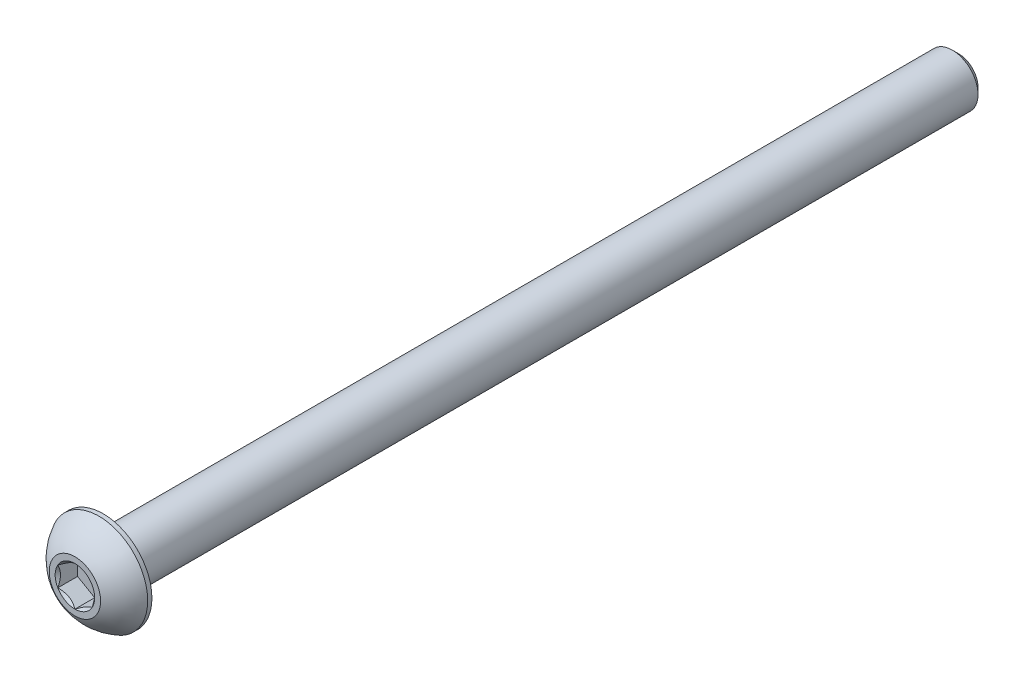
ISO-10303-21;
HEADER;
FILE_DESCRIPTION(('STEP AP214'),'2;1');
FILE_NAME('part.step','',(''),(''),'','','');
FILE_SCHEMA(('AUTOMOTIVE_DESIGN { 1 0 10303 214 1 1 1 1 }'));
ENDSEC;
DATA;
#1=APPLICATION_CONTEXT('core data for automotive mechanical design processes');
#2=APPLICATION_PROTOCOL_DEFINITION('international standard','automotive_design',2000,#1);
#3=PRODUCT_CONTEXT('',#1,'mechanical');
#4=PRODUCT('Part','Part','',(#3));
#5=PRODUCT_RELATED_PRODUCT_CATEGORY('part','',(#4));
#6=PRODUCT_DEFINITION_FORMATION('','',#4);
#7=PRODUCT_DEFINITION_CONTEXT('part definition',#1,'design');
#8=PRODUCT_DEFINITION('design','',#6,#7);
#9=PRODUCT_DEFINITION_SHAPE('','',#8);
#10=(LENGTH_UNIT() NAMED_UNIT(*) SI_UNIT(.MILLI.,.METRE.));
#11=(NAMED_UNIT(*) PLANE_ANGLE_UNIT() SI_UNIT($,.RADIAN.));
#12=(NAMED_UNIT(*) SI_UNIT($,.STERADIAN.) SOLID_ANGLE_UNIT());
#13=UNCERTAINTY_MEASURE_WITH_UNIT(LENGTH_MEASURE(1.E-05),#10,'distance_accuracy_value','');
#14=(GEOMETRIC_REPRESENTATION_CONTEXT(3) GLOBAL_UNCERTAINTY_ASSIGNED_CONTEXT((#13)) GLOBAL_UNIT_ASSIGNED_CONTEXT((#10,
#11,#12)) REPRESENTATION_CONTEXT('',''));
#15=CARTESIAN_POINT('',(0.,0.,0.));
#16=DIRECTION('',(0.,0.,1.));
#17=DIRECTION('',(1.,0.,0.));
#18=AXIS2_PLACEMENT_3D('',#15,#16,#17);
#19=CARTESIAN_POINT('',(0.,-1.49999999999999,-51.65));
#20=DIRECTION('',(0.,0.,-1.));
#21=DIRECTION('',(0.,1.,0.));
#22=AXIS2_PLACEMENT_3D('',#19,#20,#21);
#23=PLANE('',#22);
#24=CARTESIAN_POINT('',(0.,0.,-51.65));
#25=DIRECTION('',(0.,0.,-1.));
#26=DIRECTION('',(0.,1.,0.));
#27=AXIS2_PLACEMENT_3D('',#24,#25,#26);
#28=CIRCLE('',#27,1.12500000000001);
#29=CARTESIAN_POINT('',(0.,1.12500000000001,-51.65));
#30=VERTEX_POINT('',#29);
#31=EDGE_CURVE('E177',#30,#30,#28,.T.);
#32=ORIENTED_EDGE('',*,*,#31,.T.);
#33=EDGE_LOOP('',(#32));
#34=FACE_BOUND('',#33,.T.);
#35=ADVANCED_FACE('F37',(#34),#23,.T.);
#36=CARTESIAN_POINT('',(0.,0.,-51.65));
#37=DIRECTION('',(0.,0.,-1.));
#38=DIRECTION('',(0.,1.,0.));
#39=AXIS2_PLACEMENT_3D('',#36,#37,#38);
#40=CYLINDRICAL_SURFACE('',#39,1.5);
#41=CARTESIAN_POINT('',(0.,0.,-51.275));
#42=DIRECTION('',(0.,0.,-1.));
#43=DIRECTION('',(0.,1.,0.));
#44=AXIS2_PLACEMENT_3D('',#41,#42,#43);
#45=CIRCLE('',#44,1.5);
#46=CARTESIAN_POINT('',(0.,1.5,-51.275));
#47=VERTEX_POINT('',#46);
#48=EDGE_CURVE('E51',#47,#47,#45,.F.);
#49=ORIENTED_EDGE('',*,*,#48,.T.);
#50=EDGE_LOOP('',(#49));
#51=FACE_BOUND('',#50,.T.);
#52=CARTESIAN_POINT('',(0.,0.,-1.65));
#53=DIRECTION('',(0.,0.,1.));
#54=DIRECTION('',(1.,0.,0.));
#55=AXIS2_PLACEMENT_3D('',#52,#53,#54);
#56=CIRCLE('',#55,1.5);
#57=CARTESIAN_POINT('',(1.5,0.,-1.65));
#58=VERTEX_POINT('',#57);
#59=EDGE_CURVE('E174',#58,#58,#56,.F.);
#60=ORIENTED_EDGE('',*,*,#59,.T.);
#61=EDGE_LOOP('',(#60));
#62=FACE_BOUND('',#61,.T.);
#63=ADVANCED_FACE('F182',(#51,#62),#40,.T.);
#64=CARTESIAN_POINT('',(0.,0.,-51.65));
#65=DIRECTION('',(0.,0.,1.));
#66=DIRECTION('',(0.,-1.,0.));
#67=AXIS2_PLACEMENT_3D('',#64,#65,#66);
#68=CONICAL_SURFACE('',#67,1.12500000000001,0.785398163397444);
#69=ORIENTED_EDGE('',*,*,#48,.F.);
#70=EDGE_LOOP('',(#69));
#71=FACE_BOUND('',#70,.T.);
#72=ORIENTED_EDGE('',*,*,#31,.F.);
#73=EDGE_LOOP('',(#72));
#74=FACE_BOUND('',#73,.T.);
#75=ADVANCED_FACE('F39',(#71,#74),#68,.T.);
#76=CARTESIAN_POINT('',(0.,0.,-2.79483288770053));
#77=DIRECTION('',(0.,0.,1.));
#78=DIRECTION('',(0.,-1.,0.));
#79=AXIS2_PLACEMENT_3D('',#76,#77,#78);
#80=SPHERICAL_SURFACE('',#79,3.17192226735973);
#81=CARTESIAN_POINT('',(0.,0.,0.));
#82=DIRECTION('',(0.,0.,1.));
#83=DIRECTION('',(1.,0.,0.));
#84=AXIS2_PLACEMENT_3D('',#81,#82,#83);
#85=CIRCLE('',#84,1.5);
#86=CARTESIAN_POINT('',(0.,-1.5,0.));
#87=VERTEX_POINT('',#86);
#88=EDGE_CURVE('E171',#87,#87,#85,.T.);
#89=CARTESIAN_POINT('',(0.,0.,-1.4025));
#90=DIRECTION('',(0.,0.,1.));
#91=DIRECTION('',(1.,0.,0.));
#92=AXIS2_PLACEMENT_3D('',#89,#90,#91);
#93=CIRCLE('',#92,2.85);
#94=CARTESIAN_POINT('',(0.,-2.85,-1.4025));
#95=VERTEX_POINT('',#94);
#96=EDGE_CURVE('E165',#95,#95,#93,.T.);
#97=CARTESIAN_POINT('',(0.,-1.5,0.));
#98=CARTESIAN_POINT('',(0.,-1.5181600798921,-0.00974656947336525));
#99=CARTESIAN_POINT('',(0.,-1.53622513742981,-0.0196701847238475));
#100=CARTESIAN_POINT('',(0.,-1.57215840256594,-0.0398676311293121));
#101=CARTESIAN_POINT('',(0.,-1.59002661016438,-0.0501414622842944));
#102=CARTESIAN_POINT('',(0.,-1.6255593701915,-0.0710354648490241));
#103=CARTESIAN_POINT('',(0.,-1.64322392262019,-0.0816556362587714));
#104=CARTESIAN_POINT('',(0.,-1.67834266450262,-0.103238276426967));
#105=CARTESIAN_POINT('',(0.,-1.69579685395636,-0.114200745185416));
#106=CARTESIAN_POINT('',(0.,-1.73048823664554,-0.136463816635606));
#107=CARTESIAN_POINT('',(0.,-1.74772542988099,-0.147764419327347));
#108=CARTESIAN_POINT('',(0.,-1.78197627078176,-0.170699464187153));
#109=CARTESIAN_POINT('',(0.,-1.79898991844709,-0.182333906355219));
#110=CARTESIAN_POINT('',(0.,-1.83278720341135,-0.205932209546912));
#111=CARTESIAN_POINT('',(0.,-1.84957084071028,-0.21789607057054));
#112=CARTESIAN_POINT('',(0.,-1.88290172764636,-0.242148665498754));
#113=CARTESIAN_POINT('',(0.,-1.8994489772835,-0.254437399403341));
#114=CARTESIAN_POINT('',(0.,-1.93230080139369,-0.279335070725423));
#115=CARTESIAN_POINT('',(0.,-1.94860537586673,-0.291944008142919));
#116=CARTESIAN_POINT('',(0.,-1.98096565436365,-0.317477295441111));
#117=CARTESIAN_POINT('',(0.,-1.99702135838753,-0.330401645321806));
#118=CARTESIAN_POINT('',(0.,-2.02887779526296,-0.356560846652225));
#119=CARTESIAN_POINT('',(0.,-2.04467852811452,-0.369795698101948));
#120=CARTESIAN_POINT('',(0.,-2.07601901880464,-0.396570873693307));
#121=CARTESIAN_POINT('',(0.,-2.09155877664321,-0.410111197834943));
#122=CARTESIAN_POINT('',(0.,-2.12237141262985,-0.437492173862105));
#123=CARTESIAN_POINT('',(0.,-2.13764429077792,-0.451332825747633));
#124=CARTESIAN_POINT('',(0.,-2.16791736411296,-0.479309198198267));
#125=CARTESIAN_POINT('',(0.,-2.18291755929993,-0.493444918763374));
#126=CARTESIAN_POINT('',(0.,-2.21263956705415,-0.52200605739095));
#127=CARTESIAN_POINT('',(0.,-2.22736137962139,-0.536431475453418));
#128=CARTESIAN_POINT('',(0.,-2.2565210282552,-0.56556652781647));
#129=CARTESIAN_POINT('',(0.,-2.27095886432177,-0.580276162117054));
#130=CARTESIAN_POINT('',(0.,-2.2995450739765,-0.609974057702794));
#131=CARTESIAN_POINT('',(0.,-2.31369344756465,-0.624962318987951));
#132=CARTESIAN_POINT('',(0.,-2.34169535627252,-0.655211773418758));
#133=CARTESIAN_POINT('',(0.,-2.35554889139223,-0.670472966564409));
#134=CARTESIAN_POINT('',(0.,-2.38295585920366,-0.701262485885582));
#135=CARTESIAN_POINT('',(0.,-2.39650929189537,-0.716790812061104));
#136=CARTESIAN_POINT('',(0.,-2.42331090492182,-0.748108697108241));
#137=CARTESIAN_POINT('',(0.,-2.43655908525656,-0.763898255979857));
#138=CARTESIAN_POINT('',(0.,-2.46274515962755,-0.795732606824226));
#139=CARTESIAN_POINT('',(0.,-2.47568305366379,-0.811777398796979));
#140=CARTESIAN_POINT('',(0.,-2.50124363939651,-0.844116119267125));
#141=CARTESIAN_POINT('',(0.,-2.51386633109298,-0.860410047764518));
#142=CARTESIAN_POINT('',(0.,-2.53879171587278,-0.893240850042598));
#143=CARTESIAN_POINT('',(0.,-2.55109440895612,-0.909777723823285));
#144=CARTESIAN_POINT('',(0.,-2.57537512182785,-0.943088133113638));
#145=CARTESIAN_POINT('',(0.,-2.58735314161625,-0.959861668623304));
#146=CARTESIAN_POINT('',(0.,-2.61097995657956,-0.993639027894246));
#147=CARTESIAN_POINT('',(0.,-2.62262875175448,-1.01064285165552));
#148=CARTESIAN_POINT('',(0.,-2.64559269128199,-1.04487432644225));
#149=CARTESIAN_POINT('',(0.,-2.65690783563458,-1.06210197746771));
#150=CARTESIAN_POINT('',(0.,-2.67920017403639,-1.09677456077299));
#151=CARTESIAN_POINT('',(0.,-2.69017736808561,-1.11421949305282));
#152=CARTESIAN_POINT('',(0.,-2.711789634999,-1.14932001019995));
#153=CARTESIAN_POINT('',(0.,-2.72242470786316,-1.16697559506725));
#154=CARTESIAN_POINT('',(0.,-2.74334869082118,-1.20249070903943));
#155=CARTESIAN_POINT('',(0.,-2.75363760091502,-1.22035023814429));
#156=CARTESIAN_POINT('',(0.,-2.77386535089241,-1.25626645340824));
#157=CARTESIAN_POINT('',(0.,-2.78380419077596,-1.27432313956732));
#158=CARTESIAN_POINT('',(0.,-2.80332801615778,-1.31062681184411));
#159=CARTESIAN_POINT('',(0.,-2.81291300165605,-1.32887379796182));
#160=CARTESIAN_POINT('',(0.,-2.83172550494215,-1.3655511220839));
#161=CARTESIAN_POINT('',(0.,-2.84095302272998,-1.38398146008827));
#162=CARTESIAN_POINT('',(0.,-2.85,-1.4025));
#163=B_SPLINE_CURVE_WITH_KNOTS('',3,(#97,#98,#99,#100,#101,#102,#103,#104,#105,#106,#107,#108,
#109,#110,#111,#112,#113,#114,#115,#116,#117,#118,#119,#120,#121,#122,#123,#124,#125,#126,#127,
#128,#129,#130,#131,#132,#133,#134,#135,#136,#137,#138,#139,#140,#141,#142,#143,#144,#145,#146,
#147,#148,#149,#150,#151,#152,#153,#154,#155,#156,#157,#158,#159,#160,#161,#162),.UNSPECIFIED.,
.F.,.F.,(4,2,2,2,2,2,2,2,2,2,2,2,2,2,2,2,2,2,2,2,2,2,2,2,2,2,2,2,2,2,2,2,4),(0.,
0.0618298941826981,0.123659788365397,0.185489682548095,0.247319576730793,0.309149470913491,
0.37097936509619,0.432809259278888,0.494639153461585,0.556469047644284,0.618298941826982,
0.680128836009681,0.741958730192379,0.803788624375077,0.865618518557775,0.927448412740473,
0.989278306923172,1.05110820110587,1.11293809528857,1.17476798947127,1.23659788365396,
1.29842777783666,1.36025767201936,1.42208756620206,1.48391746038476,1.54574735456746,
1.60757724875015,1.66940714293285,1.73123703711555,1.79306693129825,1.85489682548095,
1.91672671966364,1.97855661384634),.UNSPECIFIED.);
#164=EDGE_CURVE('BSEAM187',#87,#95,#163,.T.);
#165=ORIENTED_EDGE('',*,*,#88,.F.);
#166=ORIENTED_EDGE('',*,*,#96,.T.);
#167=ORIENTED_EDGE('',*,*,#164,.T.);
#168=ORIENTED_EDGE('',*,*,#164,.F.);
#169=EDGE_LOOP('',(#165,#167,#166,#168));
#170=FACE_BOUND('',#169,.T.);
#171=ADVANCED_FACE('F187',(#170),#80,.T.);
#172=CARTESIAN_POINT('',(0.,-1.5,0.));
#173=DIRECTION('',(0.,0.,-1.));
#174=DIRECTION('',(-1.,0.,0.));
#175=AXIS2_PLACEMENT_3D('',#172,#173,#174);
#176=PLANE('',#175);
#177=CARTESIAN_POINT('',(0.,0.,0.));
#178=DIRECTION('',(0.,0.,1.));
#179=DIRECTION('',(1.,0.,0.));
#180=AXIS2_PLACEMENT_3D('',#177,#178,#179);
#181=CIRCLE('',#180,1.15470053837925);
#182=CARTESIAN_POINT('',(-1.,0.577350269189626,0.));
#183=VERTEX_POINT('',#182);
#184=CARTESIAN_POINT('',(-1.,-0.577350269189626,0.));
#185=VERTEX_POINT('',#184);
#186=EDGE_CURVE('E64',#183,#185,#181,.T.);
#187=ORIENTED_EDGE('',*,*,#186,.F.);
#188=CARTESIAN_POINT('',(0.,1.15470053837925,0.));
#189=VERTEX_POINT('',#188);
#190=EDGE_CURVE('E136',#189,#183,#181,.T.);
#191=ORIENTED_EDGE('',*,*,#190,.F.);
#192=CARTESIAN_POINT('',(1.,0.577350269189626,0.));
#193=VERTEX_POINT('',#192);
#194=EDGE_CURVE('E133',#193,#189,#181,.T.);
#195=ORIENTED_EDGE('',*,*,#194,.F.);
#196=CARTESIAN_POINT('',(1.,-0.577350269189626,0.));
#197=VERTEX_POINT('',#196);
#198=EDGE_CURVE('E104',#197,#193,#181,.T.);
#199=ORIENTED_EDGE('',*,*,#198,.F.);
#200=CARTESIAN_POINT('',(0.,-1.15470053837925,0.));
#201=VERTEX_POINT('',#200);
#202=EDGE_CURVE('E96',#201,#197,#181,.T.);
#203=ORIENTED_EDGE('',*,*,#202,.F.);
#204=EDGE_CURVE('E57',#185,#201,#181,.T.);
#205=ORIENTED_EDGE('',*,*,#204,.F.);
#206=EDGE_LOOP('',(#187,#191,#195,#199,#203,#205));
#207=FACE_BOUND('',#206,.T.);
#208=ORIENTED_EDGE('',*,*,#88,.T.);
#209=EDGE_LOOP('',(#208));
#210=FACE_BOUND('',#209,.T.);
#211=ADVANCED_FACE('F130',(#207,#210),#176,.F.);
#212=CARTESIAN_POINT('',(0.,-2.85,-1.65));
#213=DIRECTION('',(0.,0.,1.));
#214=DIRECTION('',(1.,0.,0.));
#215=AXIS2_PLACEMENT_3D('',#212,#213,#214);
#216=PLANE('',#215);
#217=ORIENTED_EDGE('',*,*,#59,.F.);
#218=EDGE_LOOP('',(#217));
#219=FACE_BOUND('',#218,.T.);
#220=CARTESIAN_POINT('',(0.,0.,-1.65));
#221=DIRECTION('',(0.,0.,1.));
#222=DIRECTION('',(1.,0.,0.));
#223=AXIS2_PLACEMENT_3D('',#220,#221,#222);
#224=CIRCLE('',#223,2.85);
#225=CARTESIAN_POINT('',(2.85,0.,-1.65));
#226=VERTEX_POINT('',#225);
#227=EDGE_CURVE('E168',#226,#226,#224,.T.);
#228=ORIENTED_EDGE('',*,*,#227,.F.);
#229=EDGE_LOOP('',(#228));
#230=FACE_BOUND('',#229,.T.);
#231=ADVANCED_FACE('F201',(#219,#230),#216,.F.);
#232=CARTESIAN_POINT('',(0.,0.,0.));
#233=DIRECTION('',(0.,0.,1.));
#234=DIRECTION('',(1.,0.,0.));
#235=AXIS2_PLACEMENT_3D('',#232,#233,#234);
#236=CYLINDRICAL_SURFACE('',#235,2.85);
#237=ORIENTED_EDGE('',*,*,#96,.F.);
#238=EDGE_LOOP('',(#237));
#239=FACE_BOUND('',#238,.T.);
#240=ORIENTED_EDGE('',*,*,#227,.T.);
#241=EDGE_LOOP('',(#240));
#242=FACE_BOUND('',#241,.T.);
#243=ADVANCED_FACE('F204',(#239,#242),#236,.T.);
#244=CARTESIAN_POINT('',(0.,0.,0.));
#245=DIRECTION('',(0.,0.,1.));
#246=DIRECTION('',(1.,0.,0.));
#247=AXIS2_PLACEMENT_3D('',#244,#245,#246);
#248=CONICAL_SURFACE('',#247,1.15470053837925,0.78539816339745);
#249=ORIENTED_EDGE('',*,*,#198,.T.);
#250=CARTESIAN_POINT('',(1.,-1.15147208646462,0.370385677513861));
#251=CARTESIAN_POINT('',(1.,-1.12343447988552,0.349219919873711));
#252=CARTESIAN_POINT('',(1.,-1.09524064850697,0.328261692175909));
#253=CARTESIAN_POINT('',(1.,-1.03847715644376,0.286846022235621));
#254=CARTESIAN_POINT('',(1.,-1.00990740382975,0.266388706123658));
#255=CARTESIAN_POINT('',(1.,-0.923120894333476,0.205604794954508));
#256=CARTESIAN_POINT('',(1.,-0.864253173759059,0.166192228961397));
#257=CARTESIAN_POINT('',(1.,-0.740809858258045,0.0888206642002044));
#258=CARTESIAN_POINT('',(1.,-0.676100255137807,0.0510730391143415));
#259=CARTESIAN_POINT('',(1.,-0.543448939049124,-0.0179754124487089));
#260=CARTESIAN_POINT('',(1.,-0.475519112027778,-0.0492979721531352));
#261=CARTESIAN_POINT('',(1.,-0.373555850333528,-0.0876182211162057));
#262=CARTESIAN_POINT('',(1.,-0.341031989670907,-0.0986164083578442));
#263=CARTESIAN_POINT('',(1.,-0.275199079052293,-0.11800165785264));
#264=CARTESIAN_POINT('',(1.,-0.241889975173933,-0.126388540223301));
#265=CARTESIAN_POINT('',(1.,-0.175247517042992,-0.139974779280984));
#266=CARTESIAN_POINT('',(1.,-0.141925568218175,-0.145229209232033));
#267=CARTESIAN_POINT('',(1.,-0.0749144362322788,-0.152451313429108));
#268=CARTESIAN_POINT('',(1.,-0.0412251978501616,-0.154418486389493));
#269=CARTESIAN_POINT('',(1.,0.0249580992634212,-0.15491680160684));
#270=CARTESIAN_POINT('',(1.,0.0574512826460396,-0.153569732111366));
#271=CARTESIAN_POINT('',(1.,0.122148505701867,-0.147783515501016));
#272=CARTESIAN_POINT('',(1.,0.154352610132927,-0.143345079338465));
#273=CARTESIAN_POINT('',(1.,0.21879989886764,-0.131543169854797));
#274=CARTESIAN_POINT('',(1.,0.251033743268954,-0.124129458961491));
#275=CARTESIAN_POINT('',(1.,0.314797132354919,-0.106771057501325));
#276=CARTESIAN_POINT('',(1.,0.346326735731005,-0.0968265787111708));
#277=CARTESIAN_POINT('',(1.,0.445594187730205,-0.0617765174456637));
#278=CARTESIAN_POINT('',(1.,0.511919139476036,-0.0326791416432759));
#279=CARTESIAN_POINT('',(1.,0.641453244657532,0.0320153296865042));
#280=CARTESIAN_POINT('',(1.,0.704650133126344,0.0676357767152411));
#281=CARTESIAN_POINT('',(1.,0.825428490174987,0.141123901346935));
#282=CARTESIAN_POINT('',(1.,0.883132947867685,0.178791947135463));
#283=CARTESIAN_POINT('',(1.,0.968148853704565,0.237022852943162));
#284=CARTESIAN_POINT('',(1.,0.996120570380285,0.256638475762856));
#285=CARTESIAN_POINT('',(1.,1.05168177729901,0.29638851706127));
#286=CARTESIAN_POINT('',(1.,1.079271369977,0.316522792198831));
#287=CARTESIAN_POINT('',(1.,1.10670185346329,0.336872119072971));
#288=B_SPLINE_CURVE_WITH_KNOTS('',3,(#250,#251,#252,#253,#254,#255,#256,#257,#258,#259,#260,
#261,#262,#263,#264,#265,#266,#267,#268,#269,#270,#271,#272,#273,#274,#275,#276,#277,#278,#279,
#280,#281,#282,#283,#284,#285,#286,#287),.UNSPECIFIED.,.F.,.F.,(4,2,2,2,2,2,2,2,2,2,2,2,2,2,2,2,
2,2,4),(0.,0.105386459083291,0.210799187330124,0.423233611565469,0.647793540908503,
0.871580877738609,0.97449307418142,1.07741235827201,1.17846428203205,1.27953161415762,
1.3769408673961,1.47432772585408,1.57343322804293,1.67253043972851,1.88917353996827,
2.10660791038813,2.31323734249843,2.41572589232044,2.51818641476503),.UNSPECIFIED.);
#289=EDGE_CURVE('E11',#197,#193,#288,.T.);
#290=ORIENTED_EDGE('',*,*,#289,.F.);
#291=EDGE_LOOP('',(#249,#290));
#292=FACE_BOUND('',#291,.T.);
#293=ADVANCED_FACE('F108',(#292),#248,.F.);
#294=ORIENTED_EDGE('',*,*,#194,.T.);
#295=CARTESIAN_POINT('',(1.0002,0.577234799135788,0.000115487372614006));
#296=CARTESIAN_POINT('',(0.965817404992819,0.597085599618622,-0.0197220691742671));
#297=CARTESIAN_POINT('',(0.930859881860175,0.617268335009456,-0.0383949793611112));
#298=CARTESIAN_POINT('',(0.85957719704391,0.658423412276686,-0.0725852572768422));
#299=CARTESIAN_POINT('',(0.823245249471016,0.67939967198808,-0.0880835909765416));
#300=CARTESIAN_POINT('',(0.749983386196689,0.721697428470846,-0.114632692857735));
#301=CARTESIAN_POINT('',(0.713072148554586,0.743008141459637,-0.125750226003074));
#302=CARTESIAN_POINT('',(0.638437270689141,0.786098608286186,-0.142880134223818));
#303=CARTESIAN_POINT('',(0.600715911891364,0.807877044942281,-0.148905302533327));
#304=CARTESIAN_POINT('',(0.535707801582066,0.845409494928863,-0.154339445032506));
#305=CARTESIAN_POINT('',(0.508505628471828,0.861114676896602,-0.155143061683268));
#306=CARTESIAN_POINT('',(0.454153959330888,0.892494627706029,-0.153793300583113));
#307=CARTESIAN_POINT('',(0.427004476245124,0.908169389073954,-0.151639270452801));
#308=CARTESIAN_POINT('',(0.345943722673039,0.954969836969511,-0.140883027871529));
#309=CARTESIAN_POINT('',(0.292435859021572,0.985862616452447,-0.127985443584644));
#310=CARTESIAN_POINT('',(0.198523934856568,1.04008269114923,-0.0968592693978229));
#311=CARTESIAN_POINT('',(0.157679476328165,1.06366425027551,-0.0802622022981608));
#312=CARTESIAN_POINT('',(0.077590362618056,1.1099037216352,-0.0428750753147072));
#313=CARTESIAN_POINT('',(0.038340989129562,1.1325643579843,-0.0220986581825966));
#314=CARTESIAN_POINT('',(-0.000200000000000344,1.15481600843309,0.000115487372613974));
#315=B_SPLINE_CURVE_WITH_KNOTS('',3,(#295,#296,#297,#298,#299,#300,#301,#302,#303,#304,#305,
#306,#307,#308,#309,#310,#311,#312,#313,#314),.UNSPECIFIED.,.F.,.F.,(4,2,2,2,2,2,2,2,2,4),(0.,
0.133237676828559,0.26725222983449,0.3991370762693,0.530689603280769,0.624814864263847,
0.718960890149133,0.907306626112098,1.05710100361789,1.20641411519286),.UNSPECIFIED.);
#316=EDGE_CURVE('E135',#193,#189,#315,.T.);
#317=ORIENTED_EDGE('',*,*,#316,.F.);
#318=EDGE_LOOP('',(#294,#317));
#319=FACE_BOUND('',#318,.T.);
#320=ADVANCED_FACE('F289',(#319),#248,.F.);
#321=ORIENTED_EDGE('',*,*,#190,.T.);
#322=CARTESIAN_POINT('',(0.000199999999999536,1.15481600843309,0.000115487372613877));
#323=CARTESIAN_POINT('',(-0.0341825950071811,1.13496520795026,-0.0197220691742669));
#324=CARTESIAN_POINT('',(-0.0691401181398252,1.11478247255942,-0.038394979361111));
#325=CARTESIAN_POINT('',(-0.14042280295609,1.07362739529219,-0.0725852572768421));
#326=CARTESIAN_POINT('',(-0.176754750528984,1.0526511355808,-0.0880835909765415));
#327=CARTESIAN_POINT('',(-0.250016613803311,1.01035337909803,-0.114632692857735));
#328=CARTESIAN_POINT('',(-0.286927851445415,0.989042666109241,-0.125750226003074));
#329=CARTESIAN_POINT('',(-0.36156272931086,0.945952199282691,-0.142880134223818));
#330=CARTESIAN_POINT('',(-0.399284088108636,0.924173762626596,-0.148905302533327));
#331=CARTESIAN_POINT('',(-0.464292198417934,0.886641312640014,-0.154339445032506));
#332=CARTESIAN_POINT('',(-0.491494371528173,0.870936130672275,-0.155143061683268));
#333=CARTESIAN_POINT('',(-0.545846040669112,0.839556179862848,-0.153793300583113));
#334=CARTESIAN_POINT('',(-0.572995523754876,0.823881418494923,-0.151639270452801));
#335=CARTESIAN_POINT('',(-0.654056277326961,0.777080970599366,-0.140883027871529));
#336=CARTESIAN_POINT('',(-0.707564140978428,0.74618819111643,-0.127985443584644));
#337=CARTESIAN_POINT('',(-0.801476065143432,0.691968116419649,-0.0968592693978229));
#338=CARTESIAN_POINT('',(-0.842320523671834,0.668386557293371,-0.0802622022981608));
#339=CARTESIAN_POINT('',(-0.922409637381944,0.622147085933681,-0.0428750753147074));
#340=CARTESIAN_POINT('',(-0.961659010870438,0.599486449584575,-0.0220986581825969));
#341=CARTESIAN_POINT('',(-1.0002,0.577234799135788,0.000115487372613628));
#342=B_SPLINE_CURVE_WITH_KNOTS('',3,(#322,#323,#324,#325,#326,#327,#328,#329,#330,#331,#332,
#333,#334,#335,#336,#337,#338,#339,#340,#341),.UNSPECIFIED.,.F.,.F.,(4,2,2,2,2,2,2,2,2,4),(0.,
0.133237676828559,0.26725222983449,0.3991370762693,0.530689603280768,0.624814864263846,
0.718960890149133,0.907306626112098,1.05710100361789,1.20641411519286),.UNSPECIFIED.);
#343=EDGE_CURVE('E140',#189,#183,#342,.T.);
#344=ORIENTED_EDGE('',*,*,#343,.F.);
#345=EDGE_LOOP('',(#321,#344));
#346=FACE_BOUND('',#345,.T.);
#347=ADVANCED_FACE('F143',(#346),#248,.F.);
#348=ORIENTED_EDGE('',*,*,#186,.T.);
#349=CARTESIAN_POINT('',(-1.,-1.15147208646462,0.370385677513861));
#350=CARTESIAN_POINT('',(-1.,-1.12343447988552,0.349219919873711));
#351=CARTESIAN_POINT('',(-1.,-1.09524064850697,0.328261692175909));
#352=CARTESIAN_POINT('',(-1.,-1.03847715644376,0.286846022235621));
#353=CARTESIAN_POINT('',(-1.,-1.00990740382975,0.266388706123658));
#354=CARTESIAN_POINT('',(-1.,-0.923120894333476,0.205604794954509));
#355=CARTESIAN_POINT('',(-1.,-0.864253173759059,0.166192228961397));
#356=CARTESIAN_POINT('',(-1.,-0.740809858258045,0.0888206642002043));
#357=CARTESIAN_POINT('',(-1.,-0.676100255137807,0.0510730391143417));
#358=CARTESIAN_POINT('',(-1.,-0.543448939049124,-0.0179754124487087));
#359=CARTESIAN_POINT('',(-1.,-0.475519112027779,-0.0492979721531351));
#360=CARTESIAN_POINT('',(-1.,-0.373555850333529,-0.0876182211162056));
#361=CARTESIAN_POINT('',(-1.,-0.341031989670908,-0.0986164083578442));
#362=CARTESIAN_POINT('',(-1.,-0.275199079052293,-0.11800165785264));
#363=CARTESIAN_POINT('',(-1.,-0.241889975173933,-0.126388540223301));
#364=CARTESIAN_POINT('',(-1.,-0.175247517042993,-0.139974779280984));
#365=CARTESIAN_POINT('',(-1.,-0.141925568218175,-0.145229209232033));
#366=CARTESIAN_POINT('',(-1.,-0.0749144362322789,-0.152451313429108));
#367=CARTESIAN_POINT('',(-1.,-0.0412251978501616,-0.154418486389493));
#368=CARTESIAN_POINT('',(-1.,0.0249580992634211,-0.15491680160684));
#369=CARTESIAN_POINT('',(-1.,0.0574512826460394,-0.153569732111366));
#370=CARTESIAN_POINT('',(-1.,0.122148505701867,-0.147783515501016));
#371=CARTESIAN_POINT('',(-1.,0.154352610132926,-0.143345079338465));
#372=CARTESIAN_POINT('',(-1.,0.21879989886764,-0.131543169854797));
#373=CARTESIAN_POINT('',(-1.,0.251033743268954,-0.124129458961491));
#374=CARTESIAN_POINT('',(-1.,0.314797132354919,-0.106771057501325));
#375=CARTESIAN_POINT('',(-1.,0.346326735731004,-0.0968265787111709));
#376=CARTESIAN_POINT('',(-1.,0.445594187730205,-0.0617765174456641));
#377=CARTESIAN_POINT('',(-1.,0.511919139476036,-0.0326791416432763));
#378=CARTESIAN_POINT('',(-1.,0.641453244657532,0.0320153296865039));
#379=CARTESIAN_POINT('',(-1.,0.704650133126344,0.0676357767152408));
#380=CARTESIAN_POINT('',(-1.,0.825428490174986,0.141123901346934));
#381=CARTESIAN_POINT('',(-1.,0.883132947867684,0.178791947135462));
#382=CARTESIAN_POINT('',(-1.,0.968148853704565,0.237022852943162));
#383=CARTESIAN_POINT('',(-1.,0.996120570380285,0.256638475762855));
#384=CARTESIAN_POINT('',(-1.,1.05168177729901,0.29638851706127));
#385=CARTESIAN_POINT('',(-1.,1.079271369977,0.316522792198831));
#386=CARTESIAN_POINT('',(-1.,1.10670185346329,0.336872119072971));
#387=B_SPLINE_CURVE_WITH_KNOTS('',3,(#349,#350,#351,#352,#353,#354,#355,#356,#357,#358,#359,
#360,#361,#362,#363,#364,#365,#366,#367,#368,#369,#370,#371,#372,#373,#374,#375,#376,#377,#378,
#379,#380,#381,#382,#383,#384,#385,#386),.UNSPECIFIED.,.F.,.F.,(4,2,2,2,2,2,2,2,2,2,2,2,2,2,2,2,
2,2,4),(0.,0.105386459083291,0.210799187330125,0.423233611565469,0.647793540908503,
0.871580877738609,0.97449307418142,1.07741235827201,1.17846428203205,1.27953161415762,
1.3769408673961,1.47432772585408,1.57343322804293,1.67253043972851,1.88917353996827,
2.10660791038813,2.31323734249843,2.41572589232044,2.51818641476503),.UNSPECIFIED.);
#388=EDGE_CURVE('E147',#183,#185,#387,.F.);
#389=ORIENTED_EDGE('',*,*,#388,.F.);
#390=EDGE_LOOP('',(#348,#389));
#391=FACE_BOUND('',#390,.T.);
#392=ADVANCED_FACE('F283',(#391),#248,.F.);
#393=ORIENTED_EDGE('',*,*,#204,.T.);
#394=CARTESIAN_POINT('',(-1.0002,-0.577234799135788,0.000115487372614006));
#395=CARTESIAN_POINT('',(-0.965817404992819,-0.597085599618622,-0.0197220691742672));
#396=CARTESIAN_POINT('',(-0.930859881860175,-0.617268335009456,-0.0383949793611114));
#397=CARTESIAN_POINT('',(-0.85957719704391,-0.658423412276686,-0.0725852572768424));
#398=CARTESIAN_POINT('',(-0.823245249471016,-0.67939967198808,-0.0880835909765416));
#399=CARTESIAN_POINT('',(-0.749983386196688,-0.721697428470846,-0.114632692857735));
#400=CARTESIAN_POINT('',(-0.713072148554585,-0.743008141459637,-0.125750226003074));
#401=CARTESIAN_POINT('',(-0.638437270689141,-0.786098608286186,-0.142880134223818));
#402=CARTESIAN_POINT('',(-0.600715911891364,-0.807877044942281,-0.148905302533328));
#403=CARTESIAN_POINT('',(-0.535707801582066,-0.845409494928863,-0.154339445032506));
#404=CARTESIAN_POINT('',(-0.508505628471828,-0.861114676896602,-0.155143061683268));
#405=CARTESIAN_POINT('',(-0.454153959330888,-0.892494627706029,-0.153793300583113));
#406=CARTESIAN_POINT('',(-0.427004476245124,-0.908169389073954,-0.151639270452801));
#407=CARTESIAN_POINT('',(-0.34594372267304,-0.954969836969511,-0.140883027871529));
#408=CARTESIAN_POINT('',(-0.292435859021572,-0.985862616452447,-0.127985443584644));
#409=CARTESIAN_POINT('',(-0.198523934856568,-1.04008269114923,-0.0968592693978226));
#410=CARTESIAN_POINT('',(-0.157679476328165,-1.06366425027551,-0.0802622022981605));
#411=CARTESIAN_POINT('',(-0.0775903626180561,-1.1099037216352,-0.0428750753147072));
#412=CARTESIAN_POINT('',(-0.0383409891295621,-1.1325643579843,-0.0220986581825966));
#413=CARTESIAN_POINT('',(0.000200000000000129,-1.15481600843309,0.000115487372614058));
#414=B_SPLINE_CURVE_WITH_KNOTS('',3,(#394,#395,#396,#397,#398,#399,#400,#401,#402,#403,#404,
#405,#406,#407,#408,#409,#410,#411,#412,#413),.UNSPECIFIED.,.F.,.F.,(4,2,2,2,2,2,2,2,2,4),(0.,
0.133237676828559,0.267252229834491,0.399137076269301,0.530689603280769,0.624814864263846,
0.718960890149133,0.907306626112098,1.05710100361789,1.20641411519286),.UNSPECIFIED.);
#415=EDGE_CURVE('E120',#185,#201,#414,.T.);
#416=ORIENTED_EDGE('',*,*,#415,.F.);
#417=EDGE_LOOP('',(#393,#416));
#418=FACE_BOUND('',#417,.T.);
#419=ADVANCED_FACE('F231',(#418),#248,.F.);
#420=ORIENTED_EDGE('',*,*,#202,.T.);
#421=CARTESIAN_POINT('',(-0.000199999999999763,-1.15481600843309,0.000115487372614094));
#422=CARTESIAN_POINT('',(0.0341825950071808,-1.13496520795026,-0.0197220691742669));
#423=CARTESIAN_POINT('',(0.069140118139825,-1.11478247255942,-0.0383949793611111));
#424=CARTESIAN_POINT('',(0.14042280295609,-1.07362739529219,-0.072585257276842));
#425=CARTESIAN_POINT('',(0.176754750528984,-1.0526511355808,-0.0880835909765413));
#426=CARTESIAN_POINT('',(0.250016613803311,-1.01035337909803,-0.114632692857735));
#427=CARTESIAN_POINT('',(0.286927851445414,-0.989042666109241,-0.125750226003074));
#428=CARTESIAN_POINT('',(0.361562729310859,-0.945952199282691,-0.142880134223818));
#429=CARTESIAN_POINT('',(0.399284088108636,-0.924173762626596,-0.148905302533327));
#430=CARTESIAN_POINT('',(0.464292198417934,-0.886641312640015,-0.154339445032506));
#431=CARTESIAN_POINT('',(0.491494371528172,-0.870936130672276,-0.155143061683268));
#432=CARTESIAN_POINT('',(0.545846040669112,-0.839556179862848,-0.153793300583113));
#433=CARTESIAN_POINT('',(0.572995523754876,-0.823881418494924,-0.151639270452801));
#434=CARTESIAN_POINT('',(0.65405627732696,-0.777080970599367,-0.140883027871529));
#435=CARTESIAN_POINT('',(0.707564140978427,-0.74618819111643,-0.127985443584644));
#436=CARTESIAN_POINT('',(0.801476065143431,-0.691968116419649,-0.0968592693978229));
#437=CARTESIAN_POINT('',(0.842320523671834,-0.668386557293371,-0.0802622022981608));
#438=CARTESIAN_POINT('',(0.922409637381944,-0.622147085933681,-0.0428750753147075));
#439=CARTESIAN_POINT('',(0.961659010870438,-0.599486449584575,-0.022098658182597));
#440=CARTESIAN_POINT('',(1.0002,-0.577234799135788,0.000115487372613757));
#441=B_SPLINE_CURVE_WITH_KNOTS('',3,(#421,#422,#423,#424,#425,#426,#427,#428,#429,#430,#431,
#432,#433,#434,#435,#436,#437,#438,#439,#440),.UNSPECIFIED.,.F.,.F.,(4,2,2,2,2,2,2,2,2,4),(0.,
0.133237676828559,0.26725222983449,0.3991370762693,0.530689603280768,0.624814864263846,
0.718960890149133,0.907306626112097,1.05710100361789,1.20641411519286),.UNSPECIFIED.);
#442=EDGE_CURVE('E100',#201,#197,#441,.T.);
#443=ORIENTED_EDGE('',*,*,#442,.F.);
#444=EDGE_LOOP('',(#420,#443));
#445=FACE_BOUND('',#444,.T.);
#446=ADVANCED_FACE('F98',(#445),#248,.F.);
#447=CARTESIAN_POINT('',(1.,-0.577350269189625,-1.155));
#448=DIRECTION('',(0.,0.,1.));
#449=DIRECTION('',(1.,0.,0.));
#450=AXIS2_PLACEMENT_3D('',#447,#448,#449);
#451=PLANE('',#450);
#452=DIRECTION('',(0.866025403784438,0.5,0.));
#453=VECTOR('',#452,1.);
#454=CARTESIAN_POINT('',(0.,-1.15470053837925,-1.155));
#455=LINE('',#454,#453);
#456=CARTESIAN_POINT('',(0.,-1.15470053837925,-1.155));
#457=VERTEX_POINT('',#456);
#458=CARTESIAN_POINT('',(1.,-0.577350269189626,-1.155));
#459=VERTEX_POINT('',#458);
#460=EDGE_CURVE('E119',#457,#459,#455,.T.);
#461=ORIENTED_EDGE('',*,*,#460,.T.);
#462=DIRECTION('',(0.,1.,0.));
#463=VECTOR('',#462,1.);
#464=CARTESIAN_POINT('',(1.,-0.577350269189626,-1.155));
#465=LINE('',#464,#463);
#466=CARTESIAN_POINT('',(1.,0.577350269189626,-1.155));
#467=VERTEX_POINT('',#466);
#468=EDGE_CURVE('E124',#459,#467,#465,.T.);
#469=ORIENTED_EDGE('',*,*,#468,.T.);
#470=DIRECTION('',(-0.866025403784439,0.5,0.));
#471=VECTOR('',#470,1.);
#472=CARTESIAN_POINT('',(1.,0.577350269189626,-1.155));
#473=LINE('',#472,#471);
#474=CARTESIAN_POINT('',(0.,1.15470053837925,-1.155));
#475=VERTEX_POINT('',#474);
#476=EDGE_CURVE('E273',#467,#475,#473,.T.);
#477=ORIENTED_EDGE('',*,*,#476,.T.);
#478=DIRECTION('',(-0.866025403784438,-0.5,0.));
#479=VECTOR('',#478,1.);
#480=CARTESIAN_POINT('',(0.,1.15470053837925,-1.155));
#481=LINE('',#480,#479);
#482=CARTESIAN_POINT('',(-1.,0.577350269189626,-1.155));
#483=VERTEX_POINT('',#482);
#484=EDGE_CURVE('E156',#475,#483,#481,.T.);
#485=ORIENTED_EDGE('',*,*,#484,.T.);
#486=DIRECTION('',(0.,-1.,0.));
#487=VECTOR('',#486,1.);
#488=CARTESIAN_POINT('',(-1.,0.577350269189626,-1.155));
#489=LINE('',#488,#487);
#490=CARTESIAN_POINT('',(-1.,-0.577350269189626,-1.155));
#491=VERTEX_POINT('',#490);
#492=EDGE_CURVE('E277',#483,#491,#489,.T.);
#493=ORIENTED_EDGE('',*,*,#492,.T.);
#494=DIRECTION('',(0.866025403784439,-0.5,0.));
#495=VECTOR('',#494,1.);
#496=CARTESIAN_POINT('',(-1.,-0.577350269189626,-1.155));
#497=LINE('',#496,#495);
#498=EDGE_CURVE('E127',#491,#457,#497,.T.);
#499=ORIENTED_EDGE('',*,*,#498,.T.);
#500=EDGE_LOOP('',(#461,#469,#477,#485,#493,#499));
#501=FACE_BOUND('',#500,.T.);
#502=ADVANCED_FACE('F230',(#501),#451,.T.);
#503=CARTESIAN_POINT('',(1.,-0.577350269189626,-1.155));
#504=DIRECTION('',(1.,0.,0.));
#505=DIRECTION('',(0.,0.,-1.));
#506=AXIS2_PLACEMENT_3D('',#503,#504,#505);
#507=PLANE('',#506);
#508=DIRECTION('',(0.,0.,1.));
#509=VECTOR('',#508,1.);
#510=CARTESIAN_POINT('',(1.,-0.577350269189626,-1.155));
#511=LINE('',#510,#509);
#512=EDGE_CURVE('E116',#459,#197,#511,.T.);
#513=ORIENTED_EDGE('',*,*,#512,.T.);
#514=ORIENTED_EDGE('',*,*,#289,.T.);
#515=DIRECTION('',(0.,0.,1.));
#516=VECTOR('',#515,1.);
#517=CARTESIAN_POINT('',(1.,0.577350269189626,-1.155));
#518=LINE('',#517,#516);
#519=EDGE_CURVE('E126',#467,#193,#518,.T.);
#520=ORIENTED_EDGE('',*,*,#519,.F.);
#521=ORIENTED_EDGE('',*,*,#468,.F.);
#522=EDGE_LOOP('',(#513,#514,#520,#521));
#523=FACE_BOUND('',#522,.T.);
#524=ADVANCED_FACE('F122',(#523),#507,.F.);
#525=CARTESIAN_POINT('',(1.,0.577350269189626,-1.155));
#526=DIRECTION('',(0.5,0.866025403784439,0.));
#527=DIRECTION('',(-0.866025403784439,0.5,0.));
#528=AXIS2_PLACEMENT_3D('',#525,#526,#527);
#529=PLANE('',#528);
#530=ORIENTED_EDGE('',*,*,#519,.T.);
#531=ORIENTED_EDGE('',*,*,#316,.T.);
#532=DIRECTION('',(0.,0.,1.));
#533=VECTOR('',#532,1.);
#534=CARTESIAN_POINT('',(0.,1.15470053837925,-1.155));
#535=LINE('',#534,#533);
#536=EDGE_CURVE('E152',#475,#189,#535,.T.);
#537=ORIENTED_EDGE('',*,*,#536,.F.);
#538=ORIENTED_EDGE('',*,*,#476,.F.);
#539=EDGE_LOOP('',(#530,#531,#537,#538));
#540=FACE_BOUND('',#539,.T.);
#541=ADVANCED_FACE('F150',(#540),#529,.F.);
#542=CARTESIAN_POINT('',(0.,1.15470053837925,-1.155));
#543=DIRECTION('',(-0.5,0.866025403784438,0.));
#544=DIRECTION('',(-0.866025403784438,-0.5,0.));
#545=AXIS2_PLACEMENT_3D('',#542,#543,#544);
#546=PLANE('',#545);
#547=ORIENTED_EDGE('',*,*,#536,.T.);
#548=ORIENTED_EDGE('',*,*,#343,.T.);
#549=DIRECTION('',(0.,0.,1.));
#550=VECTOR('',#549,1.);
#551=CARTESIAN_POINT('',(-1.,0.577350269189626,-1.155));
#552=LINE('',#551,#550);
#553=EDGE_CURVE('E158',#483,#183,#552,.T.);
#554=ORIENTED_EDGE('',*,*,#553,.F.);
#555=ORIENTED_EDGE('',*,*,#484,.F.);
#556=EDGE_LOOP('',(#547,#548,#554,#555));
#557=FACE_BOUND('',#556,.T.);
#558=ADVANCED_FACE('F154',(#557),#546,.F.);
#559=CARTESIAN_POINT('',(-1.,0.577350269189626,-1.155));
#560=DIRECTION('',(-1.,0.,0.));
#561=DIRECTION('',(0.,0.,1.));
#562=AXIS2_PLACEMENT_3D('',#559,#560,#561);
#563=PLANE('',#562);
#564=ORIENTED_EDGE('',*,*,#553,.T.);
#565=ORIENTED_EDGE('',*,*,#388,.T.);
#566=DIRECTION('',(0.,0.,1.));
#567=VECTOR('',#566,1.);
#568=CARTESIAN_POINT('',(-1.,-0.577350269189626,-1.155));
#569=LINE('',#568,#567);
#570=EDGE_CURVE('E160',#491,#185,#569,.T.);
#571=ORIENTED_EDGE('',*,*,#570,.F.);
#572=ORIENTED_EDGE('',*,*,#492,.F.);
#573=EDGE_LOOP('',(#564,#565,#571,#572));
#574=FACE_BOUND('',#573,.T.);
#575=ADVANCED_FACE('F252',(#574),#563,.F.);
#576=CARTESIAN_POINT('',(-1.,-0.577350269189626,-1.155));
#577=DIRECTION('',(-0.5,-0.866025403784439,0.));
#578=DIRECTION('',(0.866025403784439,-0.5,0.));
#579=AXIS2_PLACEMENT_3D('',#576,#577,#578);
#580=PLANE('',#579);
#581=ORIENTED_EDGE('',*,*,#570,.T.);
#582=ORIENTED_EDGE('',*,*,#415,.T.);
#583=DIRECTION('',(0.,0.,1.));
#584=VECTOR('',#583,1.);
#585=CARTESIAN_POINT('',(0.,-1.15470053837925,-1.155));
#586=LINE('',#585,#584);
#587=EDGE_CURVE('E118',#457,#201,#586,.T.);
#588=ORIENTED_EDGE('',*,*,#587,.F.);
#589=ORIENTED_EDGE('',*,*,#498,.F.);
#590=EDGE_LOOP('',(#581,#582,#588,#589));
#591=FACE_BOUND('',#590,.T.);
#592=ADVANCED_FACE('F211',(#591),#580,.F.);
#593=CARTESIAN_POINT('',(0.,-1.15470053837925,-1.155));
#594=DIRECTION('',(0.5,-0.866025403784438,0.));
#595=DIRECTION('',(0.866025403784438,0.5,0.));
#596=AXIS2_PLACEMENT_3D('',#593,#594,#595);
#597=PLANE('',#596);
#598=ORIENTED_EDGE('',*,*,#587,.T.);
#599=ORIENTED_EDGE('',*,*,#442,.T.);
#600=ORIENTED_EDGE('',*,*,#512,.F.);
#601=ORIENTED_EDGE('',*,*,#460,.F.);
#602=EDGE_LOOP('',(#598,#599,#600,#601));
#603=FACE_BOUND('',#602,.T.);
#604=ADVANCED_FACE('F114',(#603),#597,.F.);
#605=CLOSED_SHELL('',(#35,#63,#75,#171,#211,#231,#243,#293,#320,#347,#392,#419,#446,#502,#524,
#541,#558,#575,#592,#604));
#606=MANIFOLD_SOLID_BREP('B2',#605);
#607=ADVANCED_BREP_SHAPE_REPRESENTATION('',(#18,#606),#14);
#608=SHAPE_DEFINITION_REPRESENTATION(#9,#607);
ENDSEC;
END-ISO-10303-21;
